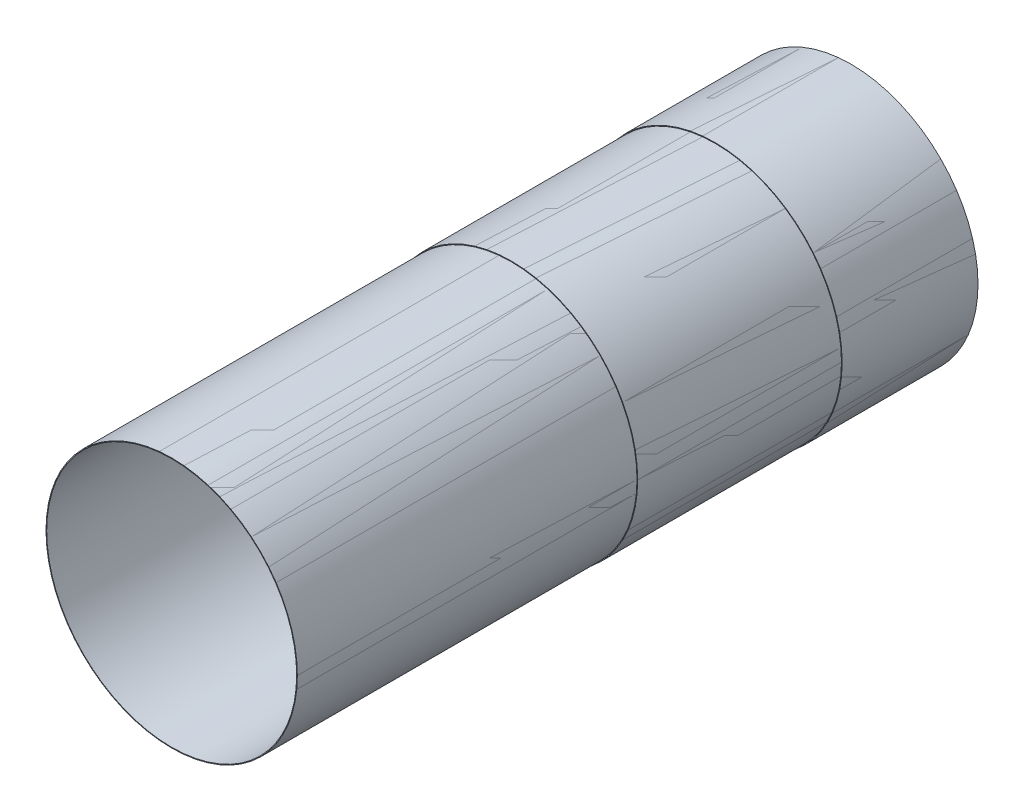
ISO-10303-21;
HEADER;
FILE_DESCRIPTION(('STEP AP214'),'2;1');
FILE_NAME('part.step','',(''),(''),'','','');
FILE_SCHEMA(('AUTOMOTIVE_DESIGN { 1 0 10303 214 1 1 1 1 }'));
ENDSEC;
DATA;
#1=APPLICATION_CONTEXT('core data for automotive mechanical design processes');
#2=APPLICATION_PROTOCOL_DEFINITION('international standard','automotive_design',2000,#1);
#3=PRODUCT_CONTEXT('',#1,'mechanical');
#4=PRODUCT('Part','Part','',(#3));
#5=PRODUCT_RELATED_PRODUCT_CATEGORY('part','',(#4));
#6=PRODUCT_DEFINITION_FORMATION('','',#4);
#7=PRODUCT_DEFINITION_CONTEXT('part definition',#1,'design');
#8=PRODUCT_DEFINITION('design','',#6,#7);
#9=PRODUCT_DEFINITION_SHAPE('','',#8);
#10=(LENGTH_UNIT() NAMED_UNIT(*) SI_UNIT(.MILLI.,.METRE.));
#11=(NAMED_UNIT(*) PLANE_ANGLE_UNIT() SI_UNIT($,.RADIAN.));
#12=(NAMED_UNIT(*) SI_UNIT($,.STERADIAN.) SOLID_ANGLE_UNIT());
#13=UNCERTAINTY_MEASURE_WITH_UNIT(LENGTH_MEASURE(1.E-05),#10,'distance_accuracy_value','');
#14=(GEOMETRIC_REPRESENTATION_CONTEXT(3) GLOBAL_UNCERTAINTY_ASSIGNED_CONTEXT((#13)) GLOBAL_UNIT_ASSIGNED_CONTEXT((#10,
#11,#12)) REPRESENTATION_CONTEXT('',''));
#15=CARTESIAN_POINT('',(0.,0.,0.));
#16=DIRECTION('',(0.,0.,1.));
#17=DIRECTION('',(1.,0.,0.));
#18=AXIS2_PLACEMENT_3D('',#15,#16,#17);
#19=CARTESIAN_POINT('',(0.,0.,1000.));
#20=DIRECTION('',(0.,0.,-1.));
#21=DIRECTION('',(-1.,0.,0.));
#22=AXIS2_PLACEMENT_3D('',#19,#20,#21);
#23=CYLINDRICAL_SURFACE('',#22,185.);
#24=CARTESIAN_POINT('',(0.,0.,1000.));
#25=DIRECTION('',(0.,0.,1.));
#26=DIRECTION('',(1.,0.,0.));
#27=AXIS2_PLACEMENT_3D('',#24,#25,#26);
#28=CIRCLE('',#27,185.);
#29=CARTESIAN_POINT('',(185.,0.,1000.));
#30=VERTEX_POINT('',#29);
#31=EDGE_CURVE('E70',#30,#30,#28,.T.);
#32=ORIENTED_EDGE('',*,*,#31,.F.);
#33=EDGE_LOOP('',(#32));
#34=FACE_BOUND('',#33,.T.);
#35=CARTESIAN_POINT('',(0.,0.,500.));
#36=DIRECTION('',(0.,0.,1.));
#37=DIRECTION('',(1.,0.,0.));
#38=AXIS2_PLACEMENT_3D('',#35,#36,#37);
#39=CIRCLE('',#38,185.);
#40=CARTESIAN_POINT('',(185.,0.,500.));
#41=VERTEX_POINT('',#40);
#42=EDGE_CURVE('E12',#41,#41,#39,.T.);
#43=ORIENTED_EDGE('',*,*,#42,.T.);
#44=EDGE_LOOP('',(#43));
#45=FACE_BOUND('',#44,.T.);
#46=ADVANCED_FACE('F66',(#34,#45),#23,.T.);
#47=OPEN_SHELL('',(#46));
#48=SHELL_BASED_SURFACE_MODEL('B2',(#47));
#49=CARTESIAN_POINT('',(0.,0.,500.));
#50=DIRECTION('',(0.,0.,-1.));
#51=DIRECTION('',(-1.,0.,0.));
#52=AXIS2_PLACEMENT_3D('',#49,#50,#51);
#53=CYLINDRICAL_SURFACE('',#52,186.);
#54=CARTESIAN_POINT('',(0.,0.,500.));
#55=DIRECTION('',(0.,0.,1.));
#56=DIRECTION('',(1.,0.,0.));
#57=AXIS2_PLACEMENT_3D('',#54,#55,#56);
#58=CIRCLE('',#57,186.);
#59=CARTESIAN_POINT('',(186.,0.,500.));
#60=VERTEX_POINT('',#59);
#61=EDGE_CURVE('E103',#60,#60,#58,.T.);
#62=ORIENTED_EDGE('',*,*,#61,.F.);
#63=EDGE_LOOP('',(#62));
#64=FACE_BOUND('',#63,.T.);
#65=CARTESIAN_POINT('',(0.,0.,200.));
#66=DIRECTION('',(0.,0.,1.));
#67=DIRECTION('',(1.,0.,0.));
#68=AXIS2_PLACEMENT_3D('',#65,#66,#67);
#69=CIRCLE('',#68,186.);
#70=CARTESIAN_POINT('',(186.,0.,200.));
#71=VERTEX_POINT('',#70);
#72=EDGE_CURVE('E65',#71,#71,#69,.T.);
#73=ORIENTED_EDGE('',*,*,#72,.T.);
#74=EDGE_LOOP('',(#73));
#75=FACE_BOUND('',#74,.T.);
#76=ADVANCED_FACE('F99',(#64,#75),#53,.T.);
#77=OPEN_SHELL('',(#76));
#78=SHELL_BASED_SURFACE_MODEL('B7',(#77));
#79=CARTESIAN_POINT('',(0.,0.,200.));
#80=DIRECTION('',(0.,0.,-1.));
#81=DIRECTION('',(-1.,0.,0.));
#82=AXIS2_PLACEMENT_3D('',#79,#80,#81);
#83=CYLINDRICAL_SURFACE('',#82,187.);
#84=CARTESIAN_POINT('',(0.,0.,200.));
#85=DIRECTION('',(0.,0.,1.));
#86=DIRECTION('',(1.,0.,0.));
#87=AXIS2_PLACEMENT_3D('',#84,#85,#86);
#88=CIRCLE('',#87,187.);
#89=CARTESIAN_POINT('',(187.,0.,200.));
#90=VERTEX_POINT('',#89);
#91=EDGE_CURVE('E136',#90,#90,#88,.T.);
#92=ORIENTED_EDGE('',*,*,#91,.F.);
#93=EDGE_LOOP('',(#92));
#94=FACE_BOUND('',#93,.T.);
#95=CARTESIAN_POINT('',(0.,0.,0.));
#96=DIRECTION('',(0.,0.,1.));
#97=DIRECTION('',(1.,0.,0.));
#98=AXIS2_PLACEMENT_3D('',#95,#96,#97);
#99=CIRCLE('',#98,187.);
#100=CARTESIAN_POINT('',(187.,0.,0.));
#101=VERTEX_POINT('',#100);
#102=EDGE_CURVE('E98',#101,#101,#99,.T.);
#103=ORIENTED_EDGE('',*,*,#102,.T.);
#104=EDGE_LOOP('',(#103));
#105=FACE_BOUND('',#104,.T.);
#106=ADVANCED_FACE('F132',(#94,#105),#83,.T.);
#107=OPEN_SHELL('',(#106));
#108=SHELL_BASED_SURFACE_MODEL('B60',(#107));
#109=CARTESIAN_POINT('',(0.,0.,1000.));
#110=DIRECTION('',(0.,0.,1.));
#111=DIRECTION('',(1.,0.,0.));
#112=AXIS2_PLACEMENT_3D('',#109,#110,#111);
#113=PLANE('',#112);
#114=CARTESIAN_POINT('',(0.,0.,1000.));
#115=DIRECTION('',(0.,0.,1.));
#116=DIRECTION('',(1.,0.,0.));
#117=AXIS2_PLACEMENT_3D('',#114,#115,#116);
#118=CIRCLE('',#117,185.);
#119=CARTESIAN_POINT('',(185.,0.,1000.));
#120=VERTEX_POINT('',#119);
#121=EDGE_CURVE('E131',#120,#120,#118,.T.);
#122=ORIENTED_EDGE('',*,*,#121,.T.);
#123=EDGE_LOOP('',(#122));
#124=FACE_BOUND('',#123,.T.);
#125=CARTESIAN_POINT('',(0.,0.,1000.));
#126=DIRECTION('',(0.,0.,1.));
#127=DIRECTION('',(1.,0.,0.));
#128=AXIS2_PLACEMENT_3D('',#125,#126,#127);
#129=CIRCLE('',#128,184.);
#130=CARTESIAN_POINT('',(184.,0.,1000.));
#131=VERTEX_POINT('',#130);
#132=EDGE_CURVE('E175',#131,#131,#129,.T.);
#133=ORIENTED_EDGE('',*,*,#132,.F.);
#134=EDGE_LOOP('',(#133));
#135=FACE_BOUND('',#134,.T.);
#136=ADVANCED_FACE('F164',(#124,#135),#113,.T.);
#137=CARTESIAN_POINT('',(0.,0.,500.));
#138=DIRECTION('',(0.,0.,1.));
#139=DIRECTION('',(1.,0.,0.));
#140=AXIS2_PLACEMENT_3D('',#137,#138,#139);
#141=PLANE('',#140);
#142=CARTESIAN_POINT('',(0.,0.,500.));
#143=DIRECTION('',(0.,0.,1.));
#144=DIRECTION('',(1.,0.,0.));
#145=AXIS2_PLACEMENT_3D('',#142,#143,#144);
#146=CIRCLE('',#145,185.);
#147=CARTESIAN_POINT('',(185.,0.,500.));
#148=VERTEX_POINT('',#147);
#149=EDGE_CURVE('E168',#148,#148,#146,.T.);
#150=ORIENTED_EDGE('',*,*,#149,.F.);
#151=EDGE_LOOP('',(#150));
#152=FACE_BOUND('',#151,.T.);
#153=CARTESIAN_POINT('',(0.,0.,500.));
#154=DIRECTION('',(0.,0.,1.));
#155=DIRECTION('',(1.,0.,0.));
#156=AXIS2_PLACEMENT_3D('',#153,#154,#155);
#157=CIRCLE('',#156,184.);
#158=CARTESIAN_POINT('',(184.,0.,500.));
#159=VERTEX_POINT('',#158);
#160=EDGE_CURVE('E177',#159,#159,#157,.T.);
#161=ORIENTED_EDGE('',*,*,#160,.T.);
#162=EDGE_LOOP('',(#161));
#163=FACE_BOUND('',#162,.T.);
#164=ADVANCED_FACE('F187',(#152,#163),#141,.F.);
#165=CARTESIAN_POINT('',(0.,0.,1000.));
#166=DIRECTION('',(0.,0.,-1.));
#167=DIRECTION('',(-1.,0.,0.));
#168=AXIS2_PLACEMENT_3D('',#165,#166,#167);
#169=CYLINDRICAL_SURFACE('',#168,185.);
#170=ORIENTED_EDGE('',*,*,#121,.F.);
#171=EDGE_LOOP('',(#170));
#172=FACE_BOUND('',#171,.T.);
#173=ORIENTED_EDGE('',*,*,#149,.T.);
#174=EDGE_LOOP('',(#173));
#175=FACE_BOUND('',#174,.T.);
#176=ADVANCED_FACE('F166',(#172,#175),#169,.T.);
#177=CARTESIAN_POINT('',(0.,0.,1000.));
#178=DIRECTION('',(0.,0.,-1.));
#179=DIRECTION('',(-1.,0.,0.));
#180=AXIS2_PLACEMENT_3D('',#177,#178,#179);
#181=CYLINDRICAL_SURFACE('',#180,184.);
#182=ORIENTED_EDGE('',*,*,#132,.T.);
#183=EDGE_LOOP('',(#182));
#184=FACE_BOUND('',#183,.T.);
#185=ORIENTED_EDGE('',*,*,#160,.F.);
#186=EDGE_LOOP('',(#185));
#187=FACE_BOUND('',#186,.T.);
#188=ADVANCED_FACE('F183',(#184,#187),#181,.F.);
#189=CLOSED_SHELL('',(#136,#164,#176,#188));
#190=MANIFOLD_SOLID_BREP('B93',#189);
#191=CARTESIAN_POINT('',(0.,0.,500.));
#192=DIRECTION('',(0.,0.,1.));
#193=DIRECTION('',(1.,0.,0.));
#194=AXIS2_PLACEMENT_3D('',#191,#192,#193);
#195=PLANE('',#194);
#196=CARTESIAN_POINT('',(0.,0.,500.));
#197=DIRECTION('',(0.,0.,1.));
#198=DIRECTION('',(1.,0.,0.));
#199=AXIS2_PLACEMENT_3D('',#196,#197,#198);
#200=CIRCLE('',#199,186.);
#201=CARTESIAN_POINT('',(186.,0.,500.));
#202=VERTEX_POINT('',#201);
#203=EDGE_CURVE('E163',#202,#202,#200,.T.);
#204=ORIENTED_EDGE('',*,*,#203,.T.);
#205=EDGE_LOOP('',(#204));
#206=FACE_BOUND('',#205,.T.);
#207=CARTESIAN_POINT('',(0.,0.,500.));
#208=DIRECTION('',(0.,0.,1.));
#209=DIRECTION('',(1.,0.,0.));
#210=AXIS2_PLACEMENT_3D('',#207,#208,#209);
#211=CIRCLE('',#210,184.);
#212=CARTESIAN_POINT('',(184.,0.,500.));
#213=VERTEX_POINT('',#212);
#214=EDGE_CURVE('E243',#213,#213,#211,.T.);
#215=ORIENTED_EDGE('',*,*,#214,.F.);
#216=EDGE_LOOP('',(#215));
#217=FACE_BOUND('',#216,.T.);
#218=ADVANCED_FACE('F232',(#206,#217),#195,.T.);
#219=CARTESIAN_POINT('',(0.,0.,200.));
#220=DIRECTION('',(0.,0.,1.));
#221=DIRECTION('',(1.,0.,0.));
#222=AXIS2_PLACEMENT_3D('',#219,#220,#221);
#223=PLANE('',#222);
#224=CARTESIAN_POINT('',(0.,0.,200.));
#225=DIRECTION('',(0.,0.,1.));
#226=DIRECTION('',(1.,0.,0.));
#227=AXIS2_PLACEMENT_3D('',#224,#225,#226);
#228=CIRCLE('',#227,186.);
#229=CARTESIAN_POINT('',(186.,0.,200.));
#230=VERTEX_POINT('',#229);
#231=EDGE_CURVE('E236',#230,#230,#228,.T.);
#232=ORIENTED_EDGE('',*,*,#231,.F.);
#233=EDGE_LOOP('',(#232));
#234=FACE_BOUND('',#233,.T.);
#235=CARTESIAN_POINT('',(0.,0.,200.));
#236=DIRECTION('',(0.,0.,1.));
#237=DIRECTION('',(1.,0.,0.));
#238=AXIS2_PLACEMENT_3D('',#235,#236,#237);
#239=CIRCLE('',#238,184.);
#240=CARTESIAN_POINT('',(184.,0.,200.));
#241=VERTEX_POINT('',#240);
#242=EDGE_CURVE('E245',#241,#241,#239,.T.);
#243=ORIENTED_EDGE('',*,*,#242,.T.);
#244=EDGE_LOOP('',(#243));
#245=FACE_BOUND('',#244,.T.);
#246=ADVANCED_FACE('F255',(#234,#245),#223,.F.);
#247=CARTESIAN_POINT('',(0.,0.,500.));
#248=DIRECTION('',(0.,0.,-1.));
#249=DIRECTION('',(-1.,0.,0.));
#250=AXIS2_PLACEMENT_3D('',#247,#248,#249);
#251=CYLINDRICAL_SURFACE('',#250,186.);
#252=ORIENTED_EDGE('',*,*,#203,.F.);
#253=EDGE_LOOP('',(#252));
#254=FACE_BOUND('',#253,.T.);
#255=ORIENTED_EDGE('',*,*,#231,.T.);
#256=EDGE_LOOP('',(#255));
#257=FACE_BOUND('',#256,.T.);
#258=ADVANCED_FACE('F234',(#254,#257),#251,.T.);
#259=CARTESIAN_POINT('',(0.,0.,500.));
#260=DIRECTION('',(0.,0.,-1.));
#261=DIRECTION('',(-1.,0.,0.));
#262=AXIS2_PLACEMENT_3D('',#259,#260,#261);
#263=CYLINDRICAL_SURFACE('',#262,184.);
#264=ORIENTED_EDGE('',*,*,#214,.T.);
#265=EDGE_LOOP('',(#264));
#266=FACE_BOUND('',#265,.T.);
#267=ORIENTED_EDGE('',*,*,#242,.F.);
#268=EDGE_LOOP('',(#267));
#269=FACE_BOUND('',#268,.T.);
#270=ADVANCED_FACE('F251',(#266,#269),#263,.F.);
#271=CLOSED_SHELL('',(#218,#246,#258,#270));
#272=MANIFOLD_SOLID_BREP('B126',#271);
#273=CARTESIAN_POINT('',(0.,0.,200.));
#274=DIRECTION('',(0.,0.,1.));
#275=DIRECTION('',(1.,0.,0.));
#276=AXIS2_PLACEMENT_3D('',#273,#274,#275);
#277=PLANE('',#276);
#278=CARTESIAN_POINT('',(0.,0.,200.));
#279=DIRECTION('',(0.,0.,1.));
#280=DIRECTION('',(1.,0.,0.));
#281=AXIS2_PLACEMENT_3D('',#278,#279,#280);
#282=CIRCLE('',#281,187.);
#283=CARTESIAN_POINT('',(187.,0.,200.));
#284=VERTEX_POINT('',#283);
#285=EDGE_CURVE('E231',#284,#284,#282,.T.);
#286=ORIENTED_EDGE('',*,*,#285,.T.);
#287=EDGE_LOOP('',(#286));
#288=FACE_BOUND('',#287,.T.);
#289=CARTESIAN_POINT('',(0.,0.,200.));
#290=DIRECTION('',(0.,0.,1.));
#291=DIRECTION('',(1.,0.,0.));
#292=AXIS2_PLACEMENT_3D('',#289,#290,#291);
#293=CIRCLE('',#292,184.);
#294=CARTESIAN_POINT('',(184.,0.,200.));
#295=VERTEX_POINT('',#294);
#296=EDGE_CURVE('E304',#295,#295,#293,.T.);
#297=ORIENTED_EDGE('',*,*,#296,.F.);
#298=EDGE_LOOP('',(#297));
#299=FACE_BOUND('',#298,.T.);
#300=ADVANCED_FACE('F293',(#288,#299),#277,.T.);
#301=CARTESIAN_POINT('',(0.,0.,0.));
#302=DIRECTION('',(0.,0.,1.));
#303=DIRECTION('',(1.,0.,0.));
#304=AXIS2_PLACEMENT_3D('',#301,#302,#303);
#305=PLANE('',#304);
#306=CARTESIAN_POINT('',(0.,0.,0.));
#307=DIRECTION('',(0.,0.,1.));
#308=DIRECTION('',(1.,0.,0.));
#309=AXIS2_PLACEMENT_3D('',#306,#307,#308);
#310=CIRCLE('',#309,187.);
#311=CARTESIAN_POINT('',(187.,0.,0.));
#312=VERTEX_POINT('',#311);
#313=EDGE_CURVE('E297',#312,#312,#310,.T.);
#314=ORIENTED_EDGE('',*,*,#313,.F.);
#315=EDGE_LOOP('',(#314));
#316=FACE_BOUND('',#315,.T.);
#317=CARTESIAN_POINT('',(0.,0.,0.));
#318=DIRECTION('',(0.,0.,1.));
#319=DIRECTION('',(1.,0.,0.));
#320=AXIS2_PLACEMENT_3D('',#317,#318,#319);
#321=CIRCLE('',#320,184.);
#322=CARTESIAN_POINT('',(184.,0.,0.));
#323=VERTEX_POINT('',#322);
#324=EDGE_CURVE('E306',#323,#323,#321,.T.);
#325=ORIENTED_EDGE('',*,*,#324,.T.);
#326=EDGE_LOOP('',(#325));
#327=FACE_BOUND('',#326,.T.);
#328=ADVANCED_FACE('F316',(#316,#327),#305,.F.);
#329=CARTESIAN_POINT('',(0.,0.,200.));
#330=DIRECTION('',(0.,0.,-1.));
#331=DIRECTION('',(-1.,0.,0.));
#332=AXIS2_PLACEMENT_3D('',#329,#330,#331);
#333=CYLINDRICAL_SURFACE('',#332,187.);
#334=ORIENTED_EDGE('',*,*,#285,.F.);
#335=EDGE_LOOP('',(#334));
#336=FACE_BOUND('',#335,.T.);
#337=ORIENTED_EDGE('',*,*,#313,.T.);
#338=EDGE_LOOP('',(#337));
#339=FACE_BOUND('',#338,.T.);
#340=ADVANCED_FACE('F295',(#336,#339),#333,.T.);
#341=CARTESIAN_POINT('',(0.,0.,200.));
#342=DIRECTION('',(0.,0.,-1.));
#343=DIRECTION('',(-1.,0.,0.));
#344=AXIS2_PLACEMENT_3D('',#341,#342,#343);
#345=CYLINDRICAL_SURFACE('',#344,184.);
#346=ORIENTED_EDGE('',*,*,#296,.T.);
#347=EDGE_LOOP('',(#346));
#348=FACE_BOUND('',#347,.T.);
#349=ORIENTED_EDGE('',*,*,#324,.F.);
#350=EDGE_LOOP('',(#349));
#351=FACE_BOUND('',#350,.T.);
#352=ADVANCED_FACE('F312',(#348,#351),#345,.F.);
#353=CLOSED_SHELL('',(#300,#328,#340,#352));
#354=MANIFOLD_SOLID_BREP('B158',#353);
#355=ADVANCED_BREP_SHAPE_REPRESENTATION('',(#18,#190,#272,#354),#14);
#356=MANIFOLD_SURFACE_SHAPE_REPRESENTATION('',(#18,#48,#78,#108),#14);
#357=SHAPE_REPRESENTATION('',(#18),#14);
#358=SHAPE_DEFINITION_REPRESENTATION(#9,#357);
#359=SHAPE_REPRESENTATION_RELATIONSHIP('','',#357,#355);
#360=SHAPE_REPRESENTATION_RELATIONSHIP('','',#357,#356);
ENDSEC;
END-ISO-10303-21;
